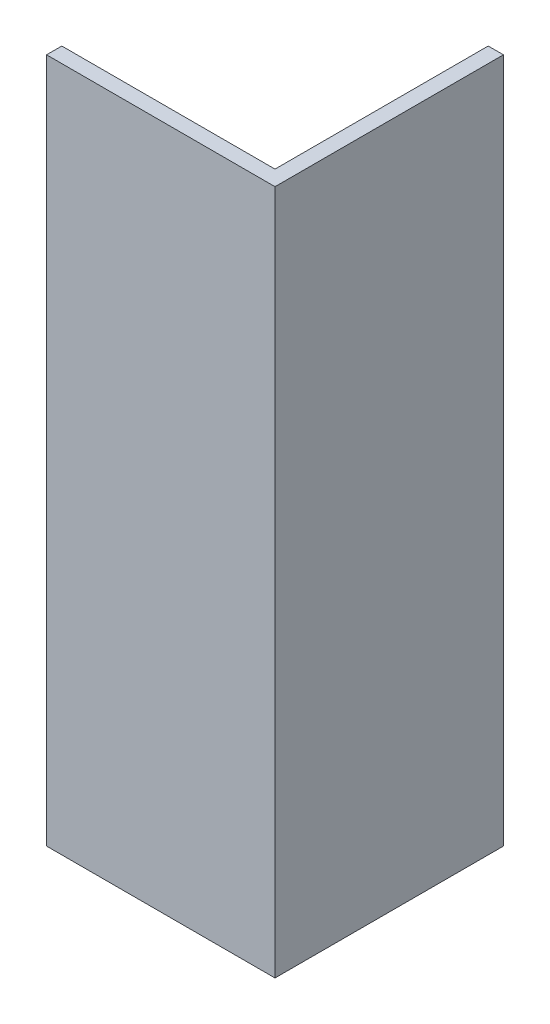
ISO-10303-21;
HEADER;
FILE_DESCRIPTION(('STEP AP214'),'2;1');
FILE_NAME('part.step','',(''),(''),'','','');
FILE_SCHEMA(('AUTOMOTIVE_DESIGN { 1 0 10303 214 1 1 1 1 }'));
ENDSEC;
DATA;
#1=APPLICATION_CONTEXT('core data for automotive mechanical design processes');
#2=APPLICATION_PROTOCOL_DEFINITION('international standard','automotive_design',2000,#1);
#3=PRODUCT_CONTEXT('',#1,'mechanical');
#4=PRODUCT('Part','Part','',(#3));
#5=PRODUCT_RELATED_PRODUCT_CATEGORY('part','',(#4));
#6=PRODUCT_DEFINITION_FORMATION('','',#4);
#7=PRODUCT_DEFINITION_CONTEXT('part definition',#1,'design');
#8=PRODUCT_DEFINITION('design','',#6,#7);
#9=PRODUCT_DEFINITION_SHAPE('','',#8);
#10=(LENGTH_UNIT() NAMED_UNIT(*) SI_UNIT(.MILLI.,.METRE.));
#11=(NAMED_UNIT(*) PLANE_ANGLE_UNIT() SI_UNIT($,.RADIAN.));
#12=(NAMED_UNIT(*) SI_UNIT($,.STERADIAN.) SOLID_ANGLE_UNIT());
#13=UNCERTAINTY_MEASURE_WITH_UNIT(LENGTH_MEASURE(1.E-05),#10,'distance_accuracy_value','');
#14=(GEOMETRIC_REPRESENTATION_CONTEXT(3) GLOBAL_UNCERTAINTY_ASSIGNED_CONTEXT((#13)) GLOBAL_UNIT_ASSIGNED_CONTEXT((#10,
#11,#12)) REPRESENTATION_CONTEXT('',''));
#15=CARTESIAN_POINT('',(0.,0.,0.));
#16=DIRECTION('',(0.,0.,1.));
#17=DIRECTION('',(1.,0.,0.));
#18=AXIS2_PLACEMENT_3D('',#15,#16,#17);
#19=CARTESIAN_POINT('',(3.,9.,0.));
#20=DIRECTION('',(0.,0.,-1.));
#21=DIRECTION('',(-1.,0.,0.));
#22=AXIS2_PLACEMENT_3D('',#19,#20,#21);
#23=PLANE('',#22);
#24=DIRECTION('',(1.,0.,0.));
#25=VECTOR('',#24,1.);
#26=CARTESIAN_POINT('',(3.,0.,0.));
#27=LINE('',#26,#25);
#28=CARTESIAN_POINT('',(0.,0.,0.));
#29=VERTEX_POINT('',#28);
#30=CARTESIAN_POINT('',(3.,0.,0.));
#31=VERTEX_POINT('',#30);
#32=EDGE_CURVE('E139',#29,#31,#27,.T.);
#33=ORIENTED_EDGE('',*,*,#32,.T.);
#34=DIRECTION('',(0.,-1.,0.));
#35=VECTOR('',#34,1.);
#36=CARTESIAN_POINT('',(3.,9.,0.));
#37=LINE('',#36,#35);
#38=CARTESIAN_POINT('',(3.,9.,0.));
#39=VERTEX_POINT('',#38);
#40=EDGE_CURVE('E11',#39,#31,#37,.T.);
#41=ORIENTED_EDGE('',*,*,#40,.F.);
#42=DIRECTION('',(1.,0.,0.));
#43=VECTOR('',#42,1.);
#44=CARTESIAN_POINT('',(3.,9.,0.));
#45=LINE('',#44,#43);
#46=CARTESIAN_POINT('',(0.,9.,0.));
#47=VERTEX_POINT('',#46);
#48=EDGE_CURVE('E155',#47,#39,#45,.T.);
#49=ORIENTED_EDGE('',*,*,#48,.F.);
#50=DIRECTION('',(0.,-1.,0.));
#51=VECTOR('',#50,1.);
#52=CARTESIAN_POINT('',(0.,9.,0.));
#53=LINE('',#52,#51);
#54=EDGE_CURVE('E135',#47,#29,#53,.T.);
#55=ORIENTED_EDGE('',*,*,#54,.T.);
#56=EDGE_LOOP('',(#33,#41,#49,#55));
#57=FACE_BOUND('',#56,.T.);
#58=ADVANCED_FACE('F43',(#57),#23,.F.);
#59=CARTESIAN_POINT('',(3.,9.,-3.));
#60=DIRECTION('',(-1.,0.,0.));
#61=DIRECTION('',(0.,0.,1.));
#62=AXIS2_PLACEMENT_3D('',#59,#60,#61);
#63=PLANE('',#62);
#64=DIRECTION('',(0.,0.,-1.));
#65=VECTOR('',#64,1.);
#66=CARTESIAN_POINT('',(3.,0.,-3.));
#67=LINE('',#66,#65);
#68=CARTESIAN_POINT('',(3.,0.,-3.));
#69=VERTEX_POINT('',#68);
#70=EDGE_CURVE('E143',#31,#69,#67,.T.);
#71=ORIENTED_EDGE('',*,*,#70,.T.);
#72=DIRECTION('',(0.,-1.,0.));
#73=VECTOR('',#72,1.);
#74=CARTESIAN_POINT('',(3.,9.,-3.));
#75=LINE('',#74,#73);
#76=CARTESIAN_POINT('',(3.,9.,-3.));
#77=VERTEX_POINT('',#76);
#78=EDGE_CURVE('E52',#77,#69,#75,.T.);
#79=ORIENTED_EDGE('',*,*,#78,.F.);
#80=DIRECTION('',(0.,0.,-1.));
#81=VECTOR('',#80,1.);
#82=CARTESIAN_POINT('',(3.,9.,-3.));
#83=LINE('',#82,#81);
#84=EDGE_CURVE('E104',#39,#77,#83,.T.);
#85=ORIENTED_EDGE('',*,*,#84,.F.);
#86=ORIENTED_EDGE('',*,*,#40,.T.);
#87=EDGE_LOOP('',(#71,#79,#85,#86));
#88=FACE_BOUND('',#87,.T.);
#89=ADVANCED_FACE('F183',(#88),#63,.F.);
#90=CARTESIAN_POINT('',(2.8,9.,-3.));
#91=DIRECTION('',(0.,0.,1.));
#92=DIRECTION('',(1.,0.,0.));
#93=AXIS2_PLACEMENT_3D('',#90,#91,#92);
#94=PLANE('',#93);
#95=DIRECTION('',(-1.,0.,0.));
#96=VECTOR('',#95,1.);
#97=CARTESIAN_POINT('',(2.8,0.,-3.));
#98=LINE('',#97,#96);
#99=CARTESIAN_POINT('',(2.8,0.,-3.));
#100=VERTEX_POINT('',#99);
#101=EDGE_CURVE('E146',#69,#100,#98,.T.);
#102=ORIENTED_EDGE('',*,*,#101,.T.);
#103=DIRECTION('',(0.,-1.,0.));
#104=VECTOR('',#103,1.);
#105=CARTESIAN_POINT('',(2.8,9.,-3.));
#106=LINE('',#105,#104);
#107=CARTESIAN_POINT('',(2.8,9.,-3.));
#108=VERTEX_POINT('',#107);
#109=EDGE_CURVE('E128',#108,#100,#106,.T.);
#110=ORIENTED_EDGE('',*,*,#109,.F.);
#111=DIRECTION('',(-1.,0.,0.));
#112=VECTOR('',#111,1.);
#113=CARTESIAN_POINT('',(2.8,9.,-3.));
#114=LINE('',#113,#112);
#115=EDGE_CURVE('E117',#77,#108,#114,.T.);
#116=ORIENTED_EDGE('',*,*,#115,.F.);
#117=ORIENTED_EDGE('',*,*,#78,.T.);
#118=EDGE_LOOP('',(#102,#110,#116,#117));
#119=FACE_BOUND('',#118,.T.);
#120=ADVANCED_FACE('F165',(#119),#94,.F.);
#121=CARTESIAN_POINT('',(2.8,9.,-0.2));
#122=DIRECTION('',(1.,0.,0.));
#123=DIRECTION('',(0.,0.,-1.));
#124=AXIS2_PLACEMENT_3D('',#121,#122,#123);
#125=PLANE('',#124);
#126=DIRECTION('',(0.,0.,1.));
#127=VECTOR('',#126,1.);
#128=CARTESIAN_POINT('',(2.8,0.,-0.2));
#129=LINE('',#128,#127);
#130=CARTESIAN_POINT('',(2.8,0.,-0.2));
#131=VERTEX_POINT('',#130);
#132=EDGE_CURVE('E126',#100,#131,#129,.T.);
#133=ORIENTED_EDGE('',*,*,#132,.T.);
#134=DIRECTION('',(0.,-1.,0.));
#135=VECTOR('',#134,1.);
#136=CARTESIAN_POINT('',(2.8,9.,-0.2));
#137=LINE('',#136,#135);
#138=CARTESIAN_POINT('',(2.8,9.,-0.2));
#139=VERTEX_POINT('',#138);
#140=EDGE_CURVE('E123',#139,#131,#137,.T.);
#141=ORIENTED_EDGE('',*,*,#140,.F.);
#142=DIRECTION('',(0.,0.,1.));
#143=VECTOR('',#142,1.);
#144=CARTESIAN_POINT('',(2.8,9.,-0.2));
#145=LINE('',#144,#143);
#146=EDGE_CURVE('E111',#108,#139,#145,.T.);
#147=ORIENTED_EDGE('',*,*,#146,.F.);
#148=ORIENTED_EDGE('',*,*,#109,.T.);
#149=EDGE_LOOP('',(#133,#141,#147,#148));
#150=FACE_BOUND('',#149,.T.);
#151=ADVANCED_FACE('F124',(#150),#125,.F.);
#152=CARTESIAN_POINT('',(0.,9.,-0.2));
#153=DIRECTION('',(0.,0.,1.));
#154=DIRECTION('',(1.,0.,0.));
#155=AXIS2_PLACEMENT_3D('',#152,#153,#154);
#156=PLANE('',#155);
#157=DIRECTION('',(-1.,0.,0.));
#158=VECTOR('',#157,1.);
#159=CARTESIAN_POINT('',(0.,0.,-0.2));
#160=LINE('',#159,#158);
#161=CARTESIAN_POINT('',(0.,0.,-0.2));
#162=VERTEX_POINT('',#161);
#163=EDGE_CURVE('E88',#131,#162,#160,.T.);
#164=ORIENTED_EDGE('',*,*,#163,.T.);
#165=DIRECTION('',(0.,-1.,0.));
#166=VECTOR('',#165,1.);
#167=CARTESIAN_POINT('',(0.,9.,-0.2));
#168=LINE('',#167,#166);
#169=CARTESIAN_POINT('',(0.,9.,-0.2));
#170=VERTEX_POINT('',#169);
#171=EDGE_CURVE('E129',#170,#162,#168,.T.);
#172=ORIENTED_EDGE('',*,*,#171,.F.);
#173=DIRECTION('',(-1.,0.,0.));
#174=VECTOR('',#173,1.);
#175=CARTESIAN_POINT('',(0.,9.,-0.2));
#176=LINE('',#175,#174);
#177=EDGE_CURVE('E115',#139,#170,#176,.T.);
#178=ORIENTED_EDGE('',*,*,#177,.F.);
#179=ORIENTED_EDGE('',*,*,#140,.T.);
#180=EDGE_LOOP('',(#164,#172,#178,#179));
#181=FACE_BOUND('',#180,.T.);
#182=ADVANCED_FACE('F131',(#181),#156,.F.);
#183=CARTESIAN_POINT('',(0.,9.,0.));
#184=DIRECTION('',(1.,0.,0.));
#185=DIRECTION('',(0.,0.,-1.));
#186=AXIS2_PLACEMENT_3D('',#183,#184,#185);
#187=PLANE('',#186);
#188=DIRECTION('',(0.,0.,1.));
#189=VECTOR('',#188,1.);
#190=CARTESIAN_POINT('',(0.,0.,0.));
#191=LINE('',#190,#189);
#192=EDGE_CURVE('E94',#162,#29,#191,.T.);
#193=ORIENTED_EDGE('',*,*,#192,.T.);
#194=ORIENTED_EDGE('',*,*,#54,.F.);
#195=DIRECTION('',(0.,0.,1.));
#196=VECTOR('',#195,1.);
#197=CARTESIAN_POINT('',(0.,9.,0.));
#198=LINE('',#197,#196);
#199=EDGE_CURVE('E63',#170,#47,#198,.T.);
#200=ORIENTED_EDGE('',*,*,#199,.F.);
#201=ORIENTED_EDGE('',*,*,#171,.T.);
#202=EDGE_LOOP('',(#193,#194,#200,#201));
#203=FACE_BOUND('',#202,.T.);
#204=ADVANCED_FACE('F172',(#203),#187,.F.);
#205=CARTESIAN_POINT('',(0.,9.,0.));
#206=DIRECTION('',(0.,-1.,0.));
#207=DIRECTION('',(0.,0.,-1.));
#208=AXIS2_PLACEMENT_3D('',#205,#206,#207);
#209=PLANE('',#208);
#210=ORIENTED_EDGE('',*,*,#48,.T.);
#211=ORIENTED_EDGE('',*,*,#84,.T.);
#212=ORIENTED_EDGE('',*,*,#115,.T.);
#213=ORIENTED_EDGE('',*,*,#146,.T.);
#214=ORIENTED_EDGE('',*,*,#177,.T.);
#215=ORIENTED_EDGE('',*,*,#199,.T.);
#216=EDGE_LOOP('',(#210,#211,#212,#213,#214,#215));
#217=FACE_BOUND('',#216,.T.);
#218=ADVANCED_FACE('F113',(#217),#209,.F.);
#219=CARTESIAN_POINT('',(0.,0.,0.));
#220=DIRECTION('',(0.,-1.,0.));
#221=DIRECTION('',(0.,0.,-1.));
#222=AXIS2_PLACEMENT_3D('',#219,#220,#221);
#223=PLANE('',#222);
#224=ORIENTED_EDGE('',*,*,#32,.F.);
#225=ORIENTED_EDGE('',*,*,#192,.F.);
#226=ORIENTED_EDGE('',*,*,#163,.F.);
#227=ORIENTED_EDGE('',*,*,#132,.F.);
#228=ORIENTED_EDGE('',*,*,#101,.F.);
#229=ORIENTED_EDGE('',*,*,#70,.F.);
#230=EDGE_LOOP('',(#224,#225,#226,#227,#228,#229));
#231=FACE_BOUND('',#230,.T.);
#232=ADVANCED_FACE('F168',(#231),#223,.T.);
#233=CLOSED_SHELL('',(#58,#89,#120,#151,#182,#204,#218,#232));
#234=MANIFOLD_SOLID_BREP('B2',#233);
#235=ADVANCED_BREP_SHAPE_REPRESENTATION('',(#18,#234),#14);
#236=SHAPE_DEFINITION_REPRESENTATION(#9,#235);
ENDSEC;
END-ISO-10303-21;
